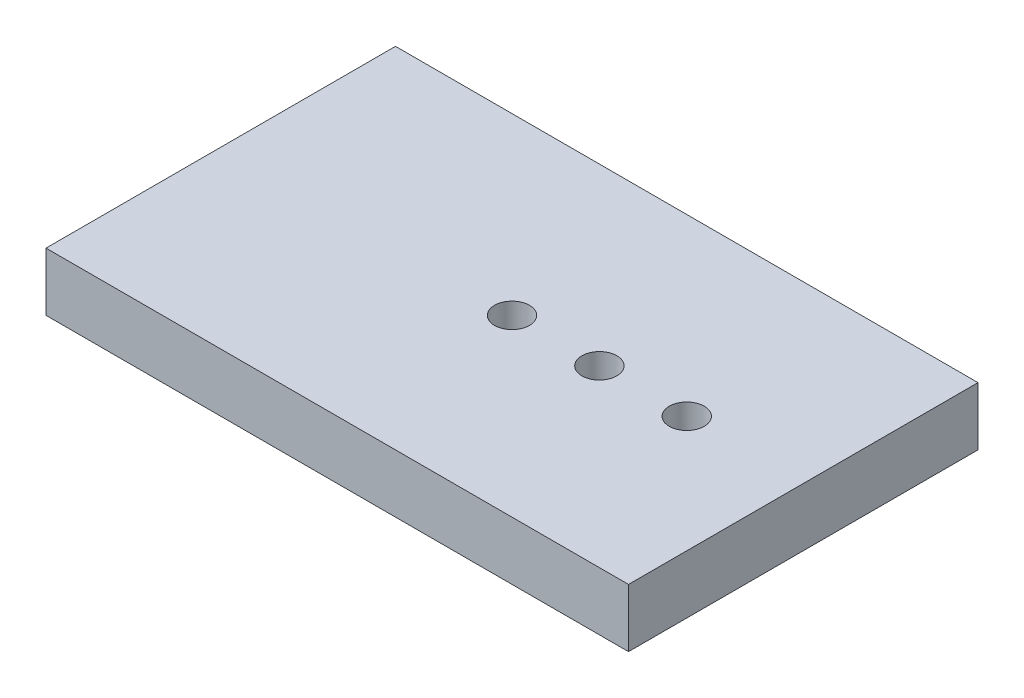
ISO-10303-21;
HEADER;
FILE_DESCRIPTION(('STEP AP214'),'2;1');
FILE_NAME('part.step','',(''),(''),'','','');
FILE_SCHEMA(('AUTOMOTIVE_DESIGN { 1 0 10303 214 1 1 1 1 }'));
ENDSEC;
DATA;
#1=APPLICATION_CONTEXT('core data for automotive mechanical design processes');
#2=APPLICATION_PROTOCOL_DEFINITION('international standard','automotive_design',2000,#1);
#3=PRODUCT_CONTEXT('',#1,'mechanical');
#4=PRODUCT('Part','Part','',(#3));
#5=PRODUCT_RELATED_PRODUCT_CATEGORY('part','',(#4));
#6=PRODUCT_DEFINITION_FORMATION('','',#4);
#7=PRODUCT_DEFINITION_CONTEXT('part definition',#1,'design');
#8=PRODUCT_DEFINITION('design','',#6,#7);
#9=PRODUCT_DEFINITION_SHAPE('','',#8);
#10=(LENGTH_UNIT() NAMED_UNIT(*) SI_UNIT(.MILLI.,.METRE.));
#11=(NAMED_UNIT(*) PLANE_ANGLE_UNIT() SI_UNIT($,.RADIAN.));
#12=(NAMED_UNIT(*) SI_UNIT($,.STERADIAN.) SOLID_ANGLE_UNIT());
#13=UNCERTAINTY_MEASURE_WITH_UNIT(LENGTH_MEASURE(1.E-05),#10,'distance_accuracy_value','');
#14=(GEOMETRIC_REPRESENTATION_CONTEXT(3) GLOBAL_UNCERTAINTY_ASSIGNED_CONTEXT((#13)) GLOBAL_UNIT_ASSIGNED_CONTEXT((#10,
#11,#12)) REPRESENTATION_CONTEXT('',''));
#15=CARTESIAN_POINT('',(0.,0.,0.));
#16=DIRECTION('',(0.,0.,1.));
#17=DIRECTION('',(1.,0.,0.));
#18=AXIS2_PLACEMENT_3D('',#15,#16,#17);
#19=CARTESIAN_POINT('',(0.,20.,0.));
#20=DIRECTION('',(0.,-1.,0.));
#21=DIRECTION('',(0.,0.,-1.));
#22=AXIS2_PLACEMENT_3D('',#19,#20,#21);
#23=CYLINDRICAL_SURFACE('',#22,3.);
#24=CARTESIAN_POINT('',(0.,0.,0.));
#25=DIRECTION('',(0.,1.,0.));
#26=DIRECTION('',(0.,0.,1.));
#27=AXIS2_PLACEMENT_3D('',#24,#25,#26);
#28=CIRCLE('',#27,3.);
#29=CARTESIAN_POINT('',(0.,0.,3.));
#30=VERTEX_POINT('',#29);
#31=EDGE_CURVE('E47',#30,#30,#28,.T.);
#32=ORIENTED_EDGE('',*,*,#31,.F.);
#33=EDGE_LOOP('',(#32));
#34=FACE_BOUND('',#33,.T.);
#35=CARTESIAN_POINT('',(0.,10.,0.));
#36=DIRECTION('',(0.,-1.,0.));
#37=DIRECTION('',(0.,0.,-1.));
#38=AXIS2_PLACEMENT_3D('',#35,#36,#37);
#39=CIRCLE('',#38,3.);
#40=CARTESIAN_POINT('',(0.,10.,-3.));
#41=VERTEX_POINT('',#40);
#42=EDGE_CURVE('E11',#41,#41,#39,.F.);
#43=ORIENTED_EDGE('',*,*,#42,.T.);
#44=EDGE_LOOP('',(#43));
#45=FACE_BOUND('',#44,.T.);
#46=ADVANCED_FACE('F39',(#34,#45),#23,.F.);
#47=CARTESIAN_POINT('',(50.,10.,30.));
#48=DIRECTION('',(-1.,0.,0.));
#49=DIRECTION('',(0.,0.,1.));
#50=AXIS2_PLACEMENT_3D('',#47,#48,#49);
#51=PLANE('',#50);
#52=DIRECTION('',(0.,0.,-1.));
#53=VECTOR('',#52,1.);
#54=CARTESIAN_POINT('',(50.,0.,30.));
#55=LINE('',#54,#53);
#56=CARTESIAN_POINT('',(50.,0.,30.));
#57=VERTEX_POINT('',#56);
#58=CARTESIAN_POINT('',(50.,0.,-30.));
#59=VERTEX_POINT('',#58);
#60=EDGE_CURVE('E107',#57,#59,#55,.T.);
#61=ORIENTED_EDGE('',*,*,#60,.T.);
#62=DIRECTION('',(0.,-1.,0.));
#63=VECTOR('',#62,1.);
#64=CARTESIAN_POINT('',(50.,10.,-30.));
#65=LINE('',#64,#63);
#66=CARTESIAN_POINT('',(50.,10.,-30.));
#67=VERTEX_POINT('',#66);
#68=EDGE_CURVE('E98',#67,#59,#65,.T.);
#69=ORIENTED_EDGE('',*,*,#68,.F.);
#70=DIRECTION('',(0.,0.,-1.));
#71=VECTOR('',#70,1.);
#72=CARTESIAN_POINT('',(50.,10.,30.));
#73=LINE('',#72,#71);
#74=CARTESIAN_POINT('',(50.,10.,30.));
#75=VERTEX_POINT('',#74);
#76=EDGE_CURVE('E92',#75,#67,#73,.T.);
#77=ORIENTED_EDGE('',*,*,#76,.F.);
#78=DIRECTION('',(0.,-1.,0.));
#79=VECTOR('',#78,1.);
#80=CARTESIAN_POINT('',(50.,10.,30.));
#81=LINE('',#80,#79);
#82=EDGE_CURVE('E103',#75,#57,#81,.T.);
#83=ORIENTED_EDGE('',*,*,#82,.T.);
#84=EDGE_LOOP('',(#61,#69,#77,#83));
#85=FACE_BOUND('',#84,.T.);
#86=ADVANCED_FACE('F123',(#85),#51,.F.);
#87=CARTESIAN_POINT('',(-50.,10.,-30.));
#88=DIRECTION('',(0.,0.,1.));
#89=DIRECTION('',(1.,0.,0.));
#90=AXIS2_PLACEMENT_3D('',#87,#88,#89);
#91=PLANE('',#90);
#92=DIRECTION('',(-1.,0.,0.));
#93=VECTOR('',#92,1.);
#94=CARTESIAN_POINT('',(-50.,0.,-30.));
#95=LINE('',#94,#93);
#96=CARTESIAN_POINT('',(-50.,0.,-30.));
#97=VERTEX_POINT('',#96);
#98=EDGE_CURVE('E97',#59,#97,#95,.T.);
#99=ORIENTED_EDGE('',*,*,#98,.T.);
#100=DIRECTION('',(0.,-1.,0.));
#101=VECTOR('',#100,1.);
#102=CARTESIAN_POINT('',(-50.,10.,-30.));
#103=LINE('',#102,#101);
#104=CARTESIAN_POINT('',(-50.,10.,-30.));
#105=VERTEX_POINT('',#104);
#106=EDGE_CURVE('E95',#105,#97,#103,.T.);
#107=ORIENTED_EDGE('',*,*,#106,.F.);
#108=DIRECTION('',(-1.,0.,0.));
#109=VECTOR('',#108,1.);
#110=CARTESIAN_POINT('',(-50.,10.,-30.));
#111=LINE('',#110,#109);
#112=EDGE_CURVE('E86',#67,#105,#111,.T.);
#113=ORIENTED_EDGE('',*,*,#112,.F.);
#114=ORIENTED_EDGE('',*,*,#68,.T.);
#115=EDGE_LOOP('',(#99,#107,#113,#114));
#116=FACE_BOUND('',#115,.T.);
#117=ADVANCED_FACE('F96',(#116),#91,.F.);
#118=CARTESIAN_POINT('',(-50.,10.,30.));
#119=DIRECTION('',(1.,0.,0.));
#120=DIRECTION('',(0.,0.,-1.));
#121=AXIS2_PLACEMENT_3D('',#118,#119,#120);
#122=PLANE('',#121);
#123=DIRECTION('',(0.,0.,1.));
#124=VECTOR('',#123,1.);
#125=CARTESIAN_POINT('',(-50.,0.,30.));
#126=LINE('',#125,#124);
#127=CARTESIAN_POINT('',(-50.,0.,30.));
#128=VERTEX_POINT('',#127);
#129=EDGE_CURVE('E72',#97,#128,#126,.T.);
#130=ORIENTED_EDGE('',*,*,#129,.T.);
#131=DIRECTION('',(0.,-1.,0.));
#132=VECTOR('',#131,1.);
#133=CARTESIAN_POINT('',(-50.,10.,30.));
#134=LINE('',#133,#132);
#135=CARTESIAN_POINT('',(-50.,10.,30.));
#136=VERTEX_POINT('',#135);
#137=EDGE_CURVE('E99',#136,#128,#134,.T.);
#138=ORIENTED_EDGE('',*,*,#137,.F.);
#139=DIRECTION('',(0.,0.,1.));
#140=VECTOR('',#139,1.);
#141=CARTESIAN_POINT('',(-50.,10.,30.));
#142=LINE('',#141,#140);
#143=EDGE_CURVE('E90',#105,#136,#142,.T.);
#144=ORIENTED_EDGE('',*,*,#143,.F.);
#145=ORIENTED_EDGE('',*,*,#106,.T.);
#146=EDGE_LOOP('',(#130,#138,#144,#145));
#147=FACE_BOUND('',#146,.T.);
#148=ADVANCED_FACE('F101',(#147),#122,.F.);
#149=CARTESIAN_POINT('',(-50.,10.,30.));
#150=DIRECTION('',(0.,0.,-1.));
#151=DIRECTION('',(-1.,0.,0.));
#152=AXIS2_PLACEMENT_3D('',#149,#150,#151);
#153=PLANE('',#152);
#154=DIRECTION('',(1.,0.,0.));
#155=VECTOR('',#154,1.);
#156=CARTESIAN_POINT('',(-50.,0.,30.));
#157=LINE('',#156,#155);
#158=EDGE_CURVE('E78',#128,#57,#157,.T.);
#159=ORIENTED_EDGE('',*,*,#158,.T.);
#160=ORIENTED_EDGE('',*,*,#82,.F.);
#161=DIRECTION('',(1.,0.,0.));
#162=VECTOR('',#161,1.);
#163=CARTESIAN_POINT('',(-50.,10.,30.));
#164=LINE('',#163,#162);
#165=EDGE_CURVE('E55',#136,#75,#164,.T.);
#166=ORIENTED_EDGE('',*,*,#165,.F.);
#167=ORIENTED_EDGE('',*,*,#137,.T.);
#168=EDGE_LOOP('',(#159,#160,#166,#167));
#169=FACE_BOUND('',#168,.T.);
#170=ADVANCED_FACE('F126',(#169),#153,.F.);
#171=CARTESIAN_POINT('',(0.,10.,0.));
#172=DIRECTION('',(0.,-1.,0.));
#173=DIRECTION('',(0.,0.,-1.));
#174=AXIS2_PLACEMENT_3D('',#171,#172,#173);
#175=PLANE('',#174);
#176=CARTESIAN_POINT('',(15.,10.,0.));
#177=DIRECTION('',(0.,-1.,0.));
#178=DIRECTION('',(0.,0.,-1.));
#179=AXIS2_PLACEMENT_3D('',#176,#177,#178);
#180=CIRCLE('',#179,3.);
#181=CARTESIAN_POINT('',(15.,10.,-3.));
#182=VERTEX_POINT('',#181);
#183=EDGE_CURVE('E157',#182,#182,#180,.F.);
#184=ORIENTED_EDGE('',*,*,#183,.F.);
#185=EDGE_LOOP('',(#184));
#186=FACE_BOUND('',#185,.T.);
#187=CARTESIAN_POINT('',(30.,10.,0.));
#188=DIRECTION('',(0.,-1.,0.));
#189=DIRECTION('',(0.,0.,-1.));
#190=AXIS2_PLACEMENT_3D('',#187,#188,#189);
#191=CIRCLE('',#190,3.);
#192=CARTESIAN_POINT('',(30.,10.,-3.));
#193=VERTEX_POINT('',#192);
#194=EDGE_CURVE('E110',#193,#193,#191,.F.);
#195=ORIENTED_EDGE('',*,*,#194,.F.);
#196=EDGE_LOOP('',(#195));
#197=FACE_BOUND('',#196,.T.);
#198=ORIENTED_EDGE('',*,*,#76,.T.);
#199=ORIENTED_EDGE('',*,*,#112,.T.);
#200=ORIENTED_EDGE('',*,*,#143,.T.);
#201=ORIENTED_EDGE('',*,*,#165,.T.);
#202=EDGE_LOOP('',(#198,#199,#200,#201));
#203=FACE_BOUND('',#202,.T.);
#204=ORIENTED_EDGE('',*,*,#42,.F.);
#205=EDGE_LOOP('',(#204));
#206=FACE_BOUND('',#205,.T.);
#207=ADVANCED_FACE('F87',(#186,#197,#203,#206),#175,.F.);
#208=CARTESIAN_POINT('',(0.,0.,0.));
#209=DIRECTION('',(0.,-1.,0.));
#210=DIRECTION('',(0.,0.,-1.));
#211=AXIS2_PLACEMENT_3D('',#208,#209,#210);
#212=PLANE('',#211);
#213=CARTESIAN_POINT('',(15.,0.,0.));
#214=DIRECTION('',(0.,1.,0.));
#215=DIRECTION('',(0.,0.,1.));
#216=AXIS2_PLACEMENT_3D('',#213,#214,#215);
#217=CIRCLE('',#216,3.);
#218=CARTESIAN_POINT('',(15.,0.,3.));
#219=VERTEX_POINT('',#218);
#220=EDGE_CURVE('E160',#219,#219,#217,.T.);
#221=ORIENTED_EDGE('',*,*,#220,.T.);
#222=EDGE_LOOP('',(#221));
#223=FACE_BOUND('',#222,.T.);
#224=CARTESIAN_POINT('',(30.,0.,0.));
#225=DIRECTION('',(0.,1.,0.));
#226=DIRECTION('',(0.,0.,1.));
#227=AXIS2_PLACEMENT_3D('',#224,#225,#226);
#228=CIRCLE('',#227,3.);
#229=CARTESIAN_POINT('',(30.,0.,3.));
#230=VERTEX_POINT('',#229);
#231=EDGE_CURVE('E154',#230,#230,#228,.T.);
#232=ORIENTED_EDGE('',*,*,#231,.T.);
#233=EDGE_LOOP('',(#232));
#234=FACE_BOUND('',#233,.T.);
#235=ORIENTED_EDGE('',*,*,#60,.F.);
#236=ORIENTED_EDGE('',*,*,#158,.F.);
#237=ORIENTED_EDGE('',*,*,#129,.F.);
#238=ORIENTED_EDGE('',*,*,#98,.F.);
#239=EDGE_LOOP('',(#235,#236,#237,#238));
#240=FACE_BOUND('',#239,.T.);
#241=ORIENTED_EDGE('',*,*,#31,.T.);
#242=EDGE_LOOP('',(#241));
#243=FACE_BOUND('',#242,.T.);
#244=ADVANCED_FACE('F119',(#223,#234,#240,#243),#212,.T.);
#245=CARTESIAN_POINT('',(30.,20.,0.));
#246=DIRECTION('',(0.,-1.,0.));
#247=DIRECTION('',(0.,0.,-1.));
#248=AXIS2_PLACEMENT_3D('',#245,#246,#247);
#249=CYLINDRICAL_SURFACE('',#248,3.);
#250=ORIENTED_EDGE('',*,*,#231,.F.);
#251=EDGE_LOOP('',(#250));
#252=FACE_BOUND('',#251,.T.);
#253=ORIENTED_EDGE('',*,*,#194,.T.);
#254=EDGE_LOOP('',(#253));
#255=FACE_BOUND('',#254,.T.);
#256=ADVANCED_FACE('F133',(#252,#255),#249,.F.);
#257=CARTESIAN_POINT('',(15.,20.,0.));
#258=DIRECTION('',(0.,-1.,0.));
#259=DIRECTION('',(0.,0.,-1.));
#260=AXIS2_PLACEMENT_3D('',#257,#258,#259);
#261=CYLINDRICAL_SURFACE('',#260,3.);
#262=ORIENTED_EDGE('',*,*,#220,.F.);
#263=EDGE_LOOP('',(#262));
#264=FACE_BOUND('',#263,.T.);
#265=ORIENTED_EDGE('',*,*,#183,.T.);
#266=EDGE_LOOP('',(#265));
#267=FACE_BOUND('',#266,.T.);
#268=ADVANCED_FACE('F165',(#264,#267),#261,.F.);
#269=CLOSED_SHELL('',(#46,#86,#117,#148,#170,#207,#244,#256,#268));
#270=MANIFOLD_SOLID_BREP('B2',#269);
#271=ADVANCED_BREP_SHAPE_REPRESENTATION('',(#18,#270),#14);
#272=SHAPE_DEFINITION_REPRESENTATION(#9,#271);
ENDSEC;
END-ISO-10303-21;
